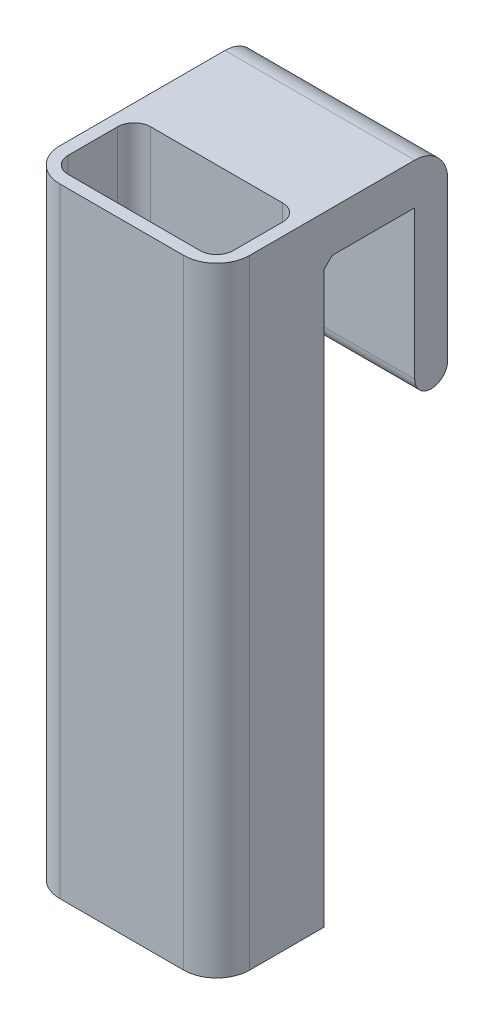
ISO-10303-21;
HEADER;
FILE_DESCRIPTION(('STEP AP214'),'2;1');
FILE_NAME('part.step','',(''),(''),'','','');
FILE_SCHEMA(('AUTOMOTIVE_DESIGN { 1 0 10303 214 1 1 1 1 }'));
ENDSEC;
DATA;
#1=APPLICATION_CONTEXT('core data for automotive mechanical design processes');
#2=APPLICATION_PROTOCOL_DEFINITION('international standard','automotive_design',2000,#1);
#3=PRODUCT_CONTEXT('',#1,'mechanical');
#4=PRODUCT('Part','Part','',(#3));
#5=PRODUCT_RELATED_PRODUCT_CATEGORY('part','',(#4));
#6=PRODUCT_DEFINITION_FORMATION('','',#4);
#7=PRODUCT_DEFINITION_CONTEXT('part definition',#1,'design');
#8=PRODUCT_DEFINITION('design','',#6,#7);
#9=PRODUCT_DEFINITION_SHAPE('','',#8);
#10=(LENGTH_UNIT() NAMED_UNIT(*) SI_UNIT(.MILLI.,.METRE.));
#11=(NAMED_UNIT(*) PLANE_ANGLE_UNIT() SI_UNIT($,.RADIAN.));
#12=(NAMED_UNIT(*) SI_UNIT($,.STERADIAN.) SOLID_ANGLE_UNIT());
#13=UNCERTAINTY_MEASURE_WITH_UNIT(LENGTH_MEASURE(1.E-05),#10,'distance_accuracy_value','');
#14=(GEOMETRIC_REPRESENTATION_CONTEXT(3) GLOBAL_UNCERTAINTY_ASSIGNED_CONTEXT((#13)) GLOBAL_UNIT_ASSIGNED_CONTEXT((#10,
#11,#12)) REPRESENTATION_CONTEXT('',''));
#15=CARTESIAN_POINT('',(0.,0.,0.));
#16=DIRECTION('',(0.,0.,1.));
#17=DIRECTION('',(1.,0.,0.));
#18=AXIS2_PLACEMENT_3D('',#15,#16,#17);
#19=CARTESIAN_POINT('',(23.,0.,0.));
#20=DIRECTION('',(0.,0.,-1.));
#21=DIRECTION('',(-1.,0.,0.));
#22=AXIS2_PLACEMENT_3D('',#19,#20,#21);
#23=PLANE('',#22);
#24=DIRECTION('',(-1.,0.,0.));
#25=VECTOR('',#24,1.);
#26=CARTESIAN_POINT('',(23.,75.,0.));
#27=LINE('',#26,#25);
#28=CARTESIAN_POINT('',(19.,75.,0.));
#29=VERTEX_POINT('',#28);
#30=CARTESIAN_POINT('',(4.,75.,0.));
#31=VERTEX_POINT('',#30);
#32=EDGE_CURVE('E241',#29,#31,#27,.T.);
#33=ORIENTED_EDGE('',*,*,#32,.T.);
#34=DIRECTION('',(0.,-1.,0.));
#35=VECTOR('',#34,1.);
#36=CARTESIAN_POINT('',(4.,0.,0.));
#37=LINE('',#36,#35);
#38=CARTESIAN_POINT('',(4.,0.,0.));
#39=VERTEX_POINT('',#38);
#40=EDGE_CURVE('E282',#31,#39,#37,.T.);
#41=ORIENTED_EDGE('',*,*,#40,.T.);
#42=DIRECTION('',(-1.,0.,0.));
#43=VECTOR('',#42,1.);
#44=CARTESIAN_POINT('',(23.,0.,0.));
#45=LINE('',#44,#43);
#46=CARTESIAN_POINT('',(19.,0.,0.));
#47=VERTEX_POINT('',#46);
#48=EDGE_CURVE('E218',#47,#39,#45,.T.);
#49=ORIENTED_EDGE('',*,*,#48,.F.);
#50=DIRECTION('',(0.,-1.,0.));
#51=VECTOR('',#50,1.);
#52=CARTESIAN_POINT('',(19.,0.,0.));
#53=LINE('',#52,#51);
#54=EDGE_CURVE('E279',#47,#29,#53,.F.);
#55=ORIENTED_EDGE('',*,*,#54,.T.);
#56=EDGE_LOOP('',(#33,#41,#49,#55));
#57=FACE_BOUND('',#56,.T.);
#58=ADVANCED_FACE('F51',(#57),#23,.F.);
#59=CARTESIAN_POINT('',(23.,0.,0.));
#60=DIRECTION('',(0.,1.,0.));
#61=DIRECTION('',(0.,0.,1.));
#62=AXIS2_PLACEMENT_3D('',#59,#60,#61);
#63=PLANE('',#62);
#64=ORIENTED_EDGE('',*,*,#48,.T.);
#65=CARTESIAN_POINT('',(4.,0.,-4.));
#66=DIRECTION('',(0.,1.,0.));
#67=DIRECTION('',(0.,0.,1.));
#68=AXIS2_PLACEMENT_3D('',#65,#66,#67);
#69=CIRCLE('',#68,4.);
#70=CARTESIAN_POINT('',(0.,0.,-4.));
#71=VERTEX_POINT('',#70);
#72=EDGE_CURVE('E289',#39,#71,#69,.F.);
#73=ORIENTED_EDGE('',*,*,#72,.T.);
#74=DIRECTION('',(0.,0.,-1.));
#75=VECTOR('',#74,1.);
#76=CARTESIAN_POINT('',(0.,0.,0.));
#77=LINE('',#76,#75);
#78=CARTESIAN_POINT('',(0.,0.,-13.));
#79=VERTEX_POINT('',#78);
#80=EDGE_CURVE('E213',#71,#79,#77,.T.);
#81=ORIENTED_EDGE('',*,*,#80,.T.);
#82=DIRECTION('',(-1.,0.,0.));
#83=VECTOR('',#82,1.);
#84=CARTESIAN_POINT('',(23.,0.,-13.));
#85=LINE('',#84,#83);
#86=CARTESIAN_POINT('',(23.,0.,-13.));
#87=VERTEX_POINT('',#86);
#88=EDGE_CURVE('E209',#87,#79,#85,.T.);
#89=ORIENTED_EDGE('',*,*,#88,.F.);
#90=DIRECTION('',(0.,0.,-1.));
#91=VECTOR('',#90,1.);
#92=CARTESIAN_POINT('',(23.,0.,0.));
#93=LINE('',#92,#91);
#94=CARTESIAN_POINT('',(23.,0.,-4.));
#95=VERTEX_POINT('',#94);
#96=EDGE_CURVE('E196',#95,#87,#93,.T.);
#97=ORIENTED_EDGE('',*,*,#96,.F.);
#98=CARTESIAN_POINT('',(19.,0.,-4.));
#99=DIRECTION('',(0.,1.,0.));
#100=DIRECTION('',(0.,0.,1.));
#101=AXIS2_PLACEMENT_3D('',#98,#99,#100);
#102=CIRCLE('',#101,4.);
#103=EDGE_CURVE('E286',#95,#47,#102,.F.);
#104=ORIENTED_EDGE('',*,*,#103,.T.);
#105=EDGE_LOOP('',(#64,#73,#81,#89,#97,#104));
#106=FACE_BOUND('',#105,.T.);
#107=ADVANCED_FACE('F211',(#106),#63,.F.);
#108=CARTESIAN_POINT('',(23.,0.,-13.));
#109=DIRECTION('',(0.,0.,1.));
#110=DIRECTION('',(1.,0.,0.));
#111=AXIS2_PLACEMENT_3D('',#108,#109,#110);
#112=PLANE('',#111);
#113=DIRECTION('',(0.,1.,0.));
#114=VECTOR('',#113,1.);
#115=CARTESIAN_POINT('',(0.,0.,-13.));
#116=LINE('',#115,#114);
#117=CARTESIAN_POINT('',(0.,69.,-13.));
#118=VERTEX_POINT('',#117);
#119=EDGE_CURVE('E244',#79,#118,#116,.T.);
#120=ORIENTED_EDGE('',*,*,#119,.T.);
#121=DIRECTION('',(1.,0.,0.));
#122=VECTOR('',#121,1.);
#123=CARTESIAN_POINT('',(23.,69.,-13.));
#124=LINE('',#123,#122);
#125=CARTESIAN_POINT('',(23.,69.,-13.));
#126=VERTEX_POINT('',#125);
#127=EDGE_CURVE('E223',#118,#126,#124,.T.);
#128=ORIENTED_EDGE('',*,*,#127,.T.);
#129=DIRECTION('',(0.,1.,0.));
#130=VECTOR('',#129,1.);
#131=CARTESIAN_POINT('',(23.,0.,-13.));
#132=LINE('',#131,#130);
#133=EDGE_CURVE('E200',#87,#126,#132,.T.);
#134=ORIENTED_EDGE('',*,*,#133,.F.);
#135=ORIENTED_EDGE('',*,*,#88,.T.);
#136=EDGE_LOOP('',(#120,#128,#134,#135));
#137=FACE_BOUND('',#136,.T.);
#138=ADVANCED_FACE('F221',(#137),#112,.F.);
#139=CARTESIAN_POINT('',(23.,70.,-24.));
#140=DIRECTION('',(0.,1.,0.));
#141=DIRECTION('',(0.,0.,1.));
#142=AXIS2_PLACEMENT_3D('',#139,#140,#141);
#143=PLANE('',#142);
#144=DIRECTION('',(0.,0.,-1.));
#145=VECTOR('',#144,1.);
#146=CARTESIAN_POINT('',(23.,70.,-24.));
#147=LINE('',#146,#145);
#148=CARTESIAN_POINT('',(23.,70.,-14.));
#149=VERTEX_POINT('',#148);
#150=CARTESIAN_POINT('',(23.,70.,-24.));
#151=VERTEX_POINT('',#150);
#152=EDGE_CURVE('E225',#149,#151,#147,.T.);
#153=ORIENTED_EDGE('',*,*,#152,.F.);
#154=DIRECTION('',(-1.,0.,0.));
#155=VECTOR('',#154,1.);
#156=CARTESIAN_POINT('',(0.,70.,-14.));
#157=LINE('',#156,#155);
#158=CARTESIAN_POINT('',(0.,70.,-14.));
#159=VERTEX_POINT('',#158);
#160=EDGE_CURVE('E267',#149,#159,#157,.T.);
#161=ORIENTED_EDGE('',*,*,#160,.T.);
#162=DIRECTION('',(0.,0.,-1.));
#163=VECTOR('',#162,1.);
#164=CARTESIAN_POINT('',(0.,70.,-24.));
#165=LINE('',#164,#163);
#166=CARTESIAN_POINT('',(0.,70.,-24.));
#167=VERTEX_POINT('',#166);
#168=EDGE_CURVE('E248',#159,#167,#165,.T.);
#169=ORIENTED_EDGE('',*,*,#168,.T.);
#170=DIRECTION('',(-1.,0.,0.));
#171=VECTOR('',#170,1.);
#172=CARTESIAN_POINT('',(23.,70.,-24.));
#173=LINE('',#172,#171);
#174=EDGE_CURVE('E219',#151,#167,#173,.T.);
#175=ORIENTED_EDGE('',*,*,#174,.F.);
#176=EDGE_LOOP('',(#153,#161,#169,#175));
#177=FACE_BOUND('',#176,.T.);
#178=ADVANCED_FACE('F516',(#177),#143,.F.);
#179=CARTESIAN_POINT('',(23.,50.,-24.));
#180=DIRECTION('',(0.,0.,-1.));
#181=DIRECTION('',(0.,1.,0.));
#182=AXIS2_PLACEMENT_3D('',#179,#180,#181);
#183=PLANE('',#182);
#184=DIRECTION('',(0.,-1.,0.));
#185=VECTOR('',#184,1.);
#186=CARTESIAN_POINT('',(0.,50.,-24.));
#187=LINE('',#186,#185);
#188=CARTESIAN_POINT('',(0.,52.,-24.));
#189=VERTEX_POINT('',#188);
#190=EDGE_CURVE('E251',#167,#189,#187,.T.);
#191=ORIENTED_EDGE('',*,*,#190,.T.);
#192=DIRECTION('',(-1.,0.,0.));
#193=VECTOR('',#192,1.);
#194=CARTESIAN_POINT('',(23.,52.,-24.));
#195=LINE('',#194,#193);
#196=CARTESIAN_POINT('',(23.,52.,-24.));
#197=VERTEX_POINT('',#196);
#198=EDGE_CURVE('E12',#189,#197,#195,.F.);
#199=ORIENTED_EDGE('',*,*,#198,.T.);
#200=DIRECTION('',(0.,-1.,0.));
#201=VECTOR('',#200,1.);
#202=CARTESIAN_POINT('',(23.,50.,-24.));
#203=LINE('',#202,#201);
#204=EDGE_CURVE('E229',#151,#197,#203,.T.);
#205=ORIENTED_EDGE('',*,*,#204,.F.);
#206=ORIENTED_EDGE('',*,*,#174,.T.);
#207=EDGE_LOOP('',(#191,#199,#205,#206));
#208=FACE_BOUND('',#207,.T.);
#209=ADVANCED_FACE('F517',(#208),#183,.F.);
#210=CARTESIAN_POINT('',(23.,75.,-28.));
#211=DIRECTION('',(0.,0.,1.));
#212=DIRECTION('',(0.,-1.,0.));
#213=AXIS2_PLACEMENT_3D('',#210,#211,#212);
#214=PLANE('',#213);
#215=DIRECTION('',(0.,1.,0.));
#216=VECTOR('',#215,1.);
#217=CARTESIAN_POINT('',(23.,75.,-28.));
#218=LINE('',#217,#216);
#219=CARTESIAN_POINT('',(23.,52.,-28.));
#220=VERTEX_POINT('',#219);
#221=CARTESIAN_POINT('',(23.,71.,-28.));
#222=VERTEX_POINT('',#221);
#223=EDGE_CURVE('E235',#220,#222,#218,.T.);
#224=ORIENTED_EDGE('',*,*,#223,.F.);
#225=DIRECTION('',(-1.,0.,0.));
#226=VECTOR('',#225,1.);
#227=CARTESIAN_POINT('',(23.,52.,-28.));
#228=LINE('',#227,#226);
#229=CARTESIAN_POINT('',(0.,52.,-28.));
#230=VERTEX_POINT('',#229);
#231=EDGE_CURVE('E372',#220,#230,#228,.T.);
#232=ORIENTED_EDGE('',*,*,#231,.T.);
#233=DIRECTION('',(0.,1.,0.));
#234=VECTOR('',#233,1.);
#235=CARTESIAN_POINT('',(0.,75.,-28.));
#236=LINE('',#235,#234);
#237=CARTESIAN_POINT('',(0.,71.,-28.));
#238=VERTEX_POINT('',#237);
#239=EDGE_CURVE('E254',#230,#238,#236,.T.);
#240=ORIENTED_EDGE('',*,*,#239,.T.);
#241=DIRECTION('',(-1.,0.,0.));
#242=VECTOR('',#241,1.);
#243=CARTESIAN_POINT('',(23.,71.,-28.));
#244=LINE('',#243,#242);
#245=EDGE_CURVE('E365',#238,#222,#244,.F.);
#246=ORIENTED_EDGE('',*,*,#245,.T.);
#247=EDGE_LOOP('',(#224,#232,#240,#246));
#248=FACE_BOUND('',#247,.T.);
#249=ADVANCED_FACE('F391',(#248),#214,.F.);
#250=CARTESIAN_POINT('',(23.,75.,0.));
#251=DIRECTION('',(0.,-1.,0.));
#252=DIRECTION('',(0.,0.,-1.));
#253=AXIS2_PLACEMENT_3D('',#250,#251,#252);
#254=PLANE('',#253);
#255=DIRECTION('',(0.,0.,1.));
#256=VECTOR('',#255,1.);
#257=CARTESIAN_POINT('',(1.5,75.,-11.5));
#258=LINE('',#257,#256);
#259=CARTESIAN_POINT('',(1.5,75.,-9.5));
#260=VERTEX_POINT('',#259);
#261=CARTESIAN_POINT('',(1.5,75.,-3.5));
#262=VERTEX_POINT('',#261);
#263=EDGE_CURVE('E405',#260,#262,#258,.T.);
#264=ORIENTED_EDGE('',*,*,#263,.F.);
#265=CARTESIAN_POINT('',(3.5,75.,-9.5));
#266=DIRECTION('',(0.,-1.,0.));
#267=DIRECTION('',(0.,0.,-1.));
#268=AXIS2_PLACEMENT_3D('',#265,#266,#267);
#269=CIRCLE('',#268,2.);
#270=CARTESIAN_POINT('',(3.5,75.,-11.5));
#271=VERTEX_POINT('',#270);
#272=EDGE_CURVE('E354',#260,#271,#269,.T.);
#273=ORIENTED_EDGE('',*,*,#272,.T.);
#274=DIRECTION('',(-1.,0.,0.));
#275=VECTOR('',#274,1.);
#276=CARTESIAN_POINT('',(21.5,75.,-11.5));
#277=LINE('',#276,#275);
#278=CARTESIAN_POINT('',(19.5,75.,-11.5));
#279=VERTEX_POINT('',#278);
#280=EDGE_CURVE('E402',#279,#271,#277,.T.);
#281=ORIENTED_EDGE('',*,*,#280,.F.);
#282=CARTESIAN_POINT('',(19.5,75.,-9.5));
#283=DIRECTION('',(0.,-1.,0.));
#284=DIRECTION('',(0.,0.,-1.));
#285=AXIS2_PLACEMENT_3D('',#282,#283,#284);
#286=CIRCLE('',#285,2.);
#287=CARTESIAN_POINT('',(21.5,75.,-9.5));
#288=VERTEX_POINT('',#287);
#289=EDGE_CURVE('E348',#279,#288,#286,.T.);
#290=ORIENTED_EDGE('',*,*,#289,.T.);
#291=DIRECTION('',(0.,0.,-1.));
#292=VECTOR('',#291,1.);
#293=CARTESIAN_POINT('',(21.5,75.,-1.5));
#294=LINE('',#293,#292);
#295=CARTESIAN_POINT('',(21.5,75.,-3.5));
#296=VERTEX_POINT('',#295);
#297=EDGE_CURVE('E420',#296,#288,#294,.T.);
#298=ORIENTED_EDGE('',*,*,#297,.F.);
#299=CARTESIAN_POINT('',(19.5,75.,-3.5));
#300=DIRECTION('',(0.,-1.,0.));
#301=DIRECTION('',(0.,0.,-1.));
#302=AXIS2_PLACEMENT_3D('',#299,#300,#301);
#303=CIRCLE('',#302,2.);
#304=CARTESIAN_POINT('',(19.5,75.,-1.5));
#305=VERTEX_POINT('',#304);
#306=EDGE_CURVE('E345',#296,#305,#303,.T.);
#307=ORIENTED_EDGE('',*,*,#306,.T.);
#308=DIRECTION('',(1.,0.,0.));
#309=VECTOR('',#308,1.);
#310=CARTESIAN_POINT('',(1.5,75.,-1.5));
#311=LINE('',#310,#309);
#312=CARTESIAN_POINT('',(3.5,75.,-1.5));
#313=VERTEX_POINT('',#312);
#314=EDGE_CURVE('E411',#313,#305,#311,.T.);
#315=ORIENTED_EDGE('',*,*,#314,.F.);
#316=CARTESIAN_POINT('',(3.5,75.,-3.5));
#317=DIRECTION('',(0.,-1.,0.));
#318=DIRECTION('',(0.,0.,-1.));
#319=AXIS2_PLACEMENT_3D('',#316,#317,#318);
#320=CIRCLE('',#319,2.);
#321=EDGE_CURVE('E351',#313,#262,#320,.T.);
#322=ORIENTED_EDGE('',*,*,#321,.T.);
#323=EDGE_LOOP('',(#264,#273,#281,#290,#298,#307,#315,#322));
#324=FACE_BOUND('',#323,.T.);
#325=DIRECTION('',(0.,0.,1.));
#326=VECTOR('',#325,1.);
#327=CARTESIAN_POINT('',(23.,75.,0.));
#328=LINE('',#327,#326);
#329=CARTESIAN_POINT('',(23.,75.,-24.));
#330=VERTEX_POINT('',#329);
#331=CARTESIAN_POINT('',(23.,75.,-4.));
#332=VERTEX_POINT('',#331);
#333=EDGE_CURVE('E238',#330,#332,#328,.T.);
#334=ORIENTED_EDGE('',*,*,#333,.F.);
#335=DIRECTION('',(-1.,0.,0.));
#336=VECTOR('',#335,1.);
#337=CARTESIAN_POINT('',(23.,75.,-24.));
#338=LINE('',#337,#336);
#339=CARTESIAN_POINT('',(0.,75.,-24.));
#340=VERTEX_POINT('',#339);
#341=EDGE_CURVE('E357',#330,#340,#338,.T.);
#342=ORIENTED_EDGE('',*,*,#341,.T.);
#343=DIRECTION('',(0.,0.,1.));
#344=VECTOR('',#343,1.);
#345=CARTESIAN_POINT('',(0.,75.,0.));
#346=LINE('',#345,#344);
#347=CARTESIAN_POINT('',(0.,75.,-4.));
#348=VERTEX_POINT('',#347);
#349=EDGE_CURVE('E206',#340,#348,#346,.T.);
#350=ORIENTED_EDGE('',*,*,#349,.T.);
#351=CARTESIAN_POINT('',(4.,75.,-4.));
#352=DIRECTION('',(0.,-1.,0.));
#353=DIRECTION('',(0.,0.,-1.));
#354=AXIS2_PLACEMENT_3D('',#351,#352,#353);
#355=CIRCLE('',#354,4.);
#356=EDGE_CURVE('E300',#348,#31,#355,.F.);
#357=ORIENTED_EDGE('',*,*,#356,.T.);
#358=ORIENTED_EDGE('',*,*,#32,.F.);
#359=CARTESIAN_POINT('',(19.,75.,-4.));
#360=DIRECTION('',(0.,-1.,0.));
#361=DIRECTION('',(0.,0.,-1.));
#362=AXIS2_PLACEMENT_3D('',#359,#360,#361);
#363=CIRCLE('',#362,4.);
#364=EDGE_CURVE('E296',#29,#332,#363,.F.);
#365=ORIENTED_EDGE('',*,*,#364,.T.);
#366=EDGE_LOOP('',(#334,#342,#350,#357,#358,#365));
#367=FACE_BOUND('',#366,.T.);
#368=ADVANCED_FACE('F456',(#324,#367),#254,.F.);
#369=CARTESIAN_POINT('',(23.,0.,0.));
#370=DIRECTION('',(-1.,0.,0.));
#371=DIRECTION('',(0.,0.,1.));
#372=AXIS2_PLACEMENT_3D('',#369,#370,#371);
#373=PLANE('',#372);
#374=CARTESIAN_POINT('',(23.,52.,-26.));
#375=DIRECTION('',(-1.,0.,0.));
#376=DIRECTION('',(0.,0.,1.));
#377=AXIS2_PLACEMENT_3D('',#374,#375,#376);
#378=CIRCLE('',#377,2.);
#379=CARTESIAN_POINT('',(23.,50.,-26.));
#380=VERTEX_POINT('',#379);
#381=EDGE_CURVE('E68',#197,#380,#378,.F.);
#382=ORIENTED_EDGE('',*,*,#381,.T.);
#383=CARTESIAN_POINT('',(23.,52.,-26.));
#384=DIRECTION('',(-1.,0.,0.));
#385=DIRECTION('',(0.,0.,1.));
#386=AXIS2_PLACEMENT_3D('',#383,#384,#385);
#387=CIRCLE('',#386,2.);
#388=EDGE_CURVE('E61',#380,#220,#387,.F.);
#389=ORIENTED_EDGE('',*,*,#388,.T.);
#390=ORIENTED_EDGE('',*,*,#223,.T.);
#391=CARTESIAN_POINT('',(23.,71.,-24.));
#392=DIRECTION('',(-1.,0.,0.));
#393=DIRECTION('',(0.,0.,1.));
#394=AXIS2_PLACEMENT_3D('',#391,#392,#393);
#395=CIRCLE('',#394,4.);
#396=EDGE_CURVE('E369',#222,#330,#395,.F.);
#397=ORIENTED_EDGE('',*,*,#396,.T.);
#398=ORIENTED_EDGE('',*,*,#333,.T.);
#399=DIRECTION('',(0.,-1.,0.));
#400=VECTOR('',#399,1.);
#401=CARTESIAN_POINT('',(23.,0.,-4.));
#402=LINE('',#401,#400);
#403=EDGE_CURVE('E203',#332,#95,#402,.T.);
#404=ORIENTED_EDGE('',*,*,#403,.T.);
#405=ORIENTED_EDGE('',*,*,#96,.T.);
#406=ORIENTED_EDGE('',*,*,#133,.T.);
#407=DIRECTION('',(0.,-0.707106781186543,0.707106781186552));
#408=VECTOR('',#407,1.);
#409=CARTESIAN_POINT('',(23.,28.0000000000005,28.0000000000001));
#410=LINE('',#409,#408);
#411=EDGE_CURVE('E276',#126,#149,#410,.F.);
#412=ORIENTED_EDGE('',*,*,#411,.T.);
#413=ORIENTED_EDGE('',*,*,#152,.T.);
#414=ORIENTED_EDGE('',*,*,#204,.T.);
#415=EDGE_LOOP('',(#382,#389,#390,#397,#398,#404,#405,#406,#412,#413,#414));
#416=FACE_BOUND('',#415,.T.);
#417=ADVANCED_FACE('F198',(#416),#373,.F.);
#418=CARTESIAN_POINT('',(0.,0.,0.));
#419=DIRECTION('',(-1.,0.,0.));
#420=DIRECTION('',(0.,0.,1.));
#421=AXIS2_PLACEMENT_3D('',#418,#419,#420);
#422=PLANE('',#421);
#423=ORIENTED_EDGE('',*,*,#239,.F.);
#424=CARTESIAN_POINT('',(0.,52.,-26.));
#425=DIRECTION('',(-1.,0.,0.));
#426=DIRECTION('',(0.,0.,1.));
#427=AXIS2_PLACEMENT_3D('',#424,#425,#426);
#428=CIRCLE('',#427,2.);
#429=CARTESIAN_POINT('',(0.,50.,-26.));
#430=VERTEX_POINT('',#429);
#431=EDGE_CURVE('E379',#230,#430,#428,.T.);
#432=ORIENTED_EDGE('',*,*,#431,.T.);
#433=CARTESIAN_POINT('',(0.,52.,-26.));
#434=DIRECTION('',(-1.,0.,0.));
#435=DIRECTION('',(0.,0.,1.));
#436=AXIS2_PLACEMENT_3D('',#433,#434,#435);
#437=CIRCLE('',#436,2.);
#438=EDGE_CURVE('E376',#430,#189,#437,.T.);
#439=ORIENTED_EDGE('',*,*,#438,.T.);
#440=ORIENTED_EDGE('',*,*,#190,.F.);
#441=ORIENTED_EDGE('',*,*,#168,.F.);
#442=DIRECTION('',(0.,0.707106781186543,-0.707106781186552));
#443=VECTOR('',#442,1.);
#444=CARTESIAN_POINT('',(0.,70.,-14.));
#445=LINE('',#444,#443);
#446=EDGE_CURVE('E273',#159,#118,#445,.F.);
#447=ORIENTED_EDGE('',*,*,#446,.T.);
#448=ORIENTED_EDGE('',*,*,#119,.F.);
#449=ORIENTED_EDGE('',*,*,#80,.F.);
#450=DIRECTION('',(0.,-1.,0.));
#451=VECTOR('',#450,1.);
#452=CARTESIAN_POINT('',(0.,75.,-4.));
#453=LINE('',#452,#451);
#454=EDGE_CURVE('E292',#71,#348,#453,.F.);
#455=ORIENTED_EDGE('',*,*,#454,.T.);
#456=ORIENTED_EDGE('',*,*,#349,.F.);
#457=CARTESIAN_POINT('',(0.,71.,-24.));
#458=DIRECTION('',(-1.,0.,0.));
#459=DIRECTION('',(0.,0.,1.));
#460=AXIS2_PLACEMENT_3D('',#457,#458,#459);
#461=CIRCLE('',#460,4.);
#462=EDGE_CURVE('E361',#340,#238,#461,.T.);
#463=ORIENTED_EDGE('',*,*,#462,.T.);
#464=EDGE_LOOP('',(#423,#432,#439,#440,#441,#447,#448,#449,#455,#456,#463));
#465=FACE_BOUND('',#464,.T.);
#466=ADVANCED_FACE('F398',(#465),#422,.T.);
#467=CARTESIAN_POINT('',(21.5,-22.3606797749979,-11.5));
#468=DIRECTION('',(0.,0.,-1.));
#469=DIRECTION('',(-1.,0.,0.));
#470=AXIS2_PLACEMENT_3D('',#467,#468,#469);
#471=PLANE('',#470);
#472=DIRECTION('',(1.,0.,0.));
#473=VECTOR('',#472,1.);
#474=CARTESIAN_POINT('',(21.5,2.,-11.5));
#475=LINE('',#474,#473);
#476=CARTESIAN_POINT('',(3.5,2.,-11.5));
#477=VERTEX_POINT('',#476);
#478=CARTESIAN_POINT('',(19.5,2.,-11.5));
#479=VERTEX_POINT('',#478);
#480=EDGE_CURVE('E414',#477,#479,#475,.T.);
#481=ORIENTED_EDGE('',*,*,#480,.T.);
#482=DIRECTION('',(0.,1.,0.));
#483=VECTOR('',#482,1.);
#484=CARTESIAN_POINT('',(19.5,75.,-11.5));
#485=LINE('',#484,#483);
#486=EDGE_CURVE('E334',#479,#279,#485,.T.);
#487=ORIENTED_EDGE('',*,*,#486,.T.);
#488=ORIENTED_EDGE('',*,*,#280,.T.);
#489=DIRECTION('',(0.,1.,0.));
#490=VECTOR('',#489,1.);
#491=CARTESIAN_POINT('',(3.5,2.,-11.5));
#492=LINE('',#491,#490);
#493=EDGE_CURVE('E331',#271,#477,#492,.F.);
#494=ORIENTED_EDGE('',*,*,#493,.T.);
#495=EDGE_LOOP('',(#481,#487,#488,#494));
#496=FACE_BOUND('',#495,.T.);
#497=ADVANCED_FACE('F569',(#496),#471,.F.);
#498=CARTESIAN_POINT('',(21.5,-22.3606797749979,-1.5));
#499=DIRECTION('',(1.,0.,0.));
#500=DIRECTION('',(0.,0.,-1.));
#501=AXIS2_PLACEMENT_3D('',#498,#499,#500);
#502=PLANE('',#501);
#503=DIRECTION('',(0.,0.,1.));
#504=VECTOR('',#503,1.);
#505=CARTESIAN_POINT('',(21.5,2.,-1.5));
#506=LINE('',#505,#504);
#507=CARTESIAN_POINT('',(21.5,2.,-9.5));
#508=VERTEX_POINT('',#507);
#509=CARTESIAN_POINT('',(21.5,2.,-3.5));
#510=VERTEX_POINT('',#509);
#511=EDGE_CURVE('E431',#508,#510,#506,.T.);
#512=ORIENTED_EDGE('',*,*,#511,.T.);
#513=DIRECTION('',(0.,1.,0.));
#514=VECTOR('',#513,1.);
#515=CARTESIAN_POINT('',(21.5,75.,-3.5));
#516=LINE('',#515,#514);
#517=EDGE_CURVE('E308',#510,#296,#516,.T.);
#518=ORIENTED_EDGE('',*,*,#517,.T.);
#519=ORIENTED_EDGE('',*,*,#297,.T.);
#520=DIRECTION('',(0.,1.,0.));
#521=VECTOR('',#520,1.);
#522=CARTESIAN_POINT('',(21.5,2.,-9.5));
#523=LINE('',#522,#521);
#524=EDGE_CURVE('E305',#288,#508,#523,.F.);
#525=ORIENTED_EDGE('',*,*,#524,.T.);
#526=EDGE_LOOP('',(#512,#518,#519,#525));
#527=FACE_BOUND('',#526,.T.);
#528=ADVANCED_FACE('F465',(#527),#502,.F.);
#529=CARTESIAN_POINT('',(1.5,-22.3606797749979,-1.5));
#530=DIRECTION('',(0.,0.,1.));
#531=DIRECTION('',(1.,0.,0.));
#532=AXIS2_PLACEMENT_3D('',#529,#530,#531);
#533=PLANE('',#532);
#534=ORIENTED_EDGE('',*,*,#314,.T.);
#535=DIRECTION('',(0.,1.,0.));
#536=VECTOR('',#535,1.);
#537=CARTESIAN_POINT('',(19.5,2.,-1.5));
#538=LINE('',#537,#536);
#539=CARTESIAN_POINT('',(19.5,2.,-1.5));
#540=VERTEX_POINT('',#539);
#541=EDGE_CURVE('E316',#305,#540,#538,.F.);
#542=ORIENTED_EDGE('',*,*,#541,.T.);
#543=DIRECTION('',(-1.,0.,0.));
#544=VECTOR('',#543,1.);
#545=CARTESIAN_POINT('',(1.5,2.,-1.5));
#546=LINE('',#545,#544);
#547=CARTESIAN_POINT('',(3.5,2.,-1.5));
#548=VERTEX_POINT('',#547);
#549=EDGE_CURVE('E423',#540,#548,#546,.T.);
#550=ORIENTED_EDGE('',*,*,#549,.T.);
#551=DIRECTION('',(0.,1.,0.));
#552=VECTOR('',#551,1.);
#553=CARTESIAN_POINT('',(3.5,75.,-1.5));
#554=LINE('',#553,#552);
#555=EDGE_CURVE('E312',#548,#313,#554,.T.);
#556=ORIENTED_EDGE('',*,*,#555,.T.);
#557=EDGE_LOOP('',(#534,#542,#550,#556));
#558=FACE_BOUND('',#557,.T.);
#559=ADVANCED_FACE('F445',(#558),#533,.F.);
#560=CARTESIAN_POINT('',(1.5,-22.3606797749979,-11.5));
#561=DIRECTION('',(-1.,0.,0.));
#562=DIRECTION('',(0.,0.,1.));
#563=AXIS2_PLACEMENT_3D('',#560,#561,#562);
#564=PLANE('',#563);
#565=ORIENTED_EDGE('',*,*,#263,.T.);
#566=DIRECTION('',(0.,1.,0.));
#567=VECTOR('',#566,1.);
#568=CARTESIAN_POINT('',(1.5,2.,-3.5));
#569=LINE('',#568,#567);
#570=CARTESIAN_POINT('',(1.5,2.,-3.5));
#571=VERTEX_POINT('',#570);
#572=EDGE_CURVE('E342',#262,#571,#569,.F.);
#573=ORIENTED_EDGE('',*,*,#572,.T.);
#574=DIRECTION('',(0.,0.,-1.));
#575=VECTOR('',#574,1.);
#576=CARTESIAN_POINT('',(1.5,2.,-11.5));
#577=LINE('',#576,#575);
#578=CARTESIAN_POINT('',(1.5,2.,-9.5));
#579=VERTEX_POINT('',#578);
#580=EDGE_CURVE('E245',#571,#579,#577,.T.);
#581=ORIENTED_EDGE('',*,*,#580,.T.);
#582=DIRECTION('',(0.,1.,0.));
#583=VECTOR('',#582,1.);
#584=CARTESIAN_POINT('',(1.5,75.,-9.5));
#585=LINE('',#584,#583);
#586=EDGE_CURVE('E338',#579,#260,#585,.T.);
#587=ORIENTED_EDGE('',*,*,#586,.T.);
#588=EDGE_LOOP('',(#565,#573,#581,#587));
#589=FACE_BOUND('',#588,.T.);
#590=ADVANCED_FACE('F458',(#589),#564,.F.);
#591=CARTESIAN_POINT('',(23.,2.,0.));
#592=DIRECTION('',(0.,1.,0.));
#593=DIRECTION('',(0.,0.,1.));
#594=AXIS2_PLACEMENT_3D('',#591,#592,#593);
#595=PLANE('',#594);
#596=ORIENTED_EDGE('',*,*,#549,.F.);
#597=CARTESIAN_POINT('',(19.5,2.,-3.5));
#598=DIRECTION('',(0.,1.,0.));
#599=DIRECTION('',(0.,0.,1.));
#600=AXIS2_PLACEMENT_3D('',#597,#598,#599);
#601=CIRCLE('',#600,2.);
#602=EDGE_CURVE('E328',#540,#510,#601,.T.);
#603=ORIENTED_EDGE('',*,*,#602,.T.);
#604=ORIENTED_EDGE('',*,*,#511,.F.);
#605=CARTESIAN_POINT('',(19.5,2.,-9.5));
#606=DIRECTION('',(0.,1.,0.));
#607=DIRECTION('',(0.,0.,1.));
#608=AXIS2_PLACEMENT_3D('',#605,#606,#607);
#609=CIRCLE('',#608,2.);
#610=EDGE_CURVE('E325',#508,#479,#609,.T.);
#611=ORIENTED_EDGE('',*,*,#610,.T.);
#612=ORIENTED_EDGE('',*,*,#480,.F.);
#613=CARTESIAN_POINT('',(3.5,2.,-9.5));
#614=DIRECTION('',(0.,1.,0.));
#615=DIRECTION('',(0.,0.,1.));
#616=AXIS2_PLACEMENT_3D('',#613,#614,#615);
#617=CIRCLE('',#616,2.);
#618=EDGE_CURVE('E319',#477,#579,#617,.T.);
#619=ORIENTED_EDGE('',*,*,#618,.T.);
#620=ORIENTED_EDGE('',*,*,#580,.F.);
#621=CARTESIAN_POINT('',(3.5,2.,-3.5));
#622=DIRECTION('',(0.,1.,0.));
#623=DIRECTION('',(0.,0.,1.));
#624=AXIS2_PLACEMENT_3D('',#621,#622,#623);
#625=CIRCLE('',#624,2.);
#626=EDGE_CURVE('E322',#571,#548,#625,.T.);
#627=ORIENTED_EDGE('',*,*,#626,.T.);
#628=EDGE_LOOP('',(#596,#603,#604,#611,#612,#619,#620,#627));
#629=FACE_BOUND('',#628,.T.);
#630=ADVANCED_FACE('F468',(#629),#595,.T.);
#631=CARTESIAN_POINT('',(23.,70.,-14.));
#632=DIRECTION('',(0.,-0.707106781186552,-0.707106781186542));
#633=DIRECTION('',(1.,0.,0.));
#634=AXIS2_PLACEMENT_3D('',#631,#632,#633);
#635=PLANE('',#634);
#636=ORIENTED_EDGE('',*,*,#411,.F.);
#637=ORIENTED_EDGE('',*,*,#127,.F.);
#638=ORIENTED_EDGE('',*,*,#446,.F.);
#639=ORIENTED_EDGE('',*,*,#160,.F.);
#640=EDGE_LOOP('',(#636,#637,#638,#639));
#641=FACE_BOUND('',#640,.T.);
#642=ADVANCED_FACE('F490',(#641),#635,.T.);
#643=CARTESIAN_POINT('',(4.,0.,-4.));
#644=DIRECTION('',(0.,1.,0.));
#645=DIRECTION('',(0.,0.,1.));
#646=AXIS2_PLACEMENT_3D('',#643,#644,#645);
#647=CYLINDRICAL_SURFACE('',#646,4.);
#648=ORIENTED_EDGE('',*,*,#356,.F.);
#649=ORIENTED_EDGE('',*,*,#454,.F.);
#650=ORIENTED_EDGE('',*,*,#72,.F.);
#651=ORIENTED_EDGE('',*,*,#40,.F.);
#652=EDGE_LOOP('',(#648,#649,#650,#651));
#653=FACE_BOUND('',#652,.T.);
#654=ADVANCED_FACE('F478',(#653),#647,.T.);
#655=CARTESIAN_POINT('',(19.,0.,-4.));
#656=DIRECTION('',(0.,-1.,0.));
#657=DIRECTION('',(0.,0.,-1.));
#658=AXIS2_PLACEMENT_3D('',#655,#656,#657);
#659=CYLINDRICAL_SURFACE('',#658,4.);
#660=ORIENTED_EDGE('',*,*,#364,.F.);
#661=ORIENTED_EDGE('',*,*,#54,.F.);
#662=ORIENTED_EDGE('',*,*,#103,.F.);
#663=ORIENTED_EDGE('',*,*,#403,.F.);
#664=EDGE_LOOP('',(#660,#661,#662,#663));
#665=FACE_BOUND('',#664,.T.);
#666=ADVANCED_FACE('F472',(#665),#659,.T.);
#667=CARTESIAN_POINT('',(19.5,-22.3606797749979,-3.5));
#668=DIRECTION('',(0.,-1.,0.));
#669=DIRECTION('',(0.,0.,-1.));
#670=AXIS2_PLACEMENT_3D('',#667,#668,#669);
#671=CYLINDRICAL_SURFACE('',#670,2.);
#672=ORIENTED_EDGE('',*,*,#602,.F.);
#673=ORIENTED_EDGE('',*,*,#541,.F.);
#674=ORIENTED_EDGE('',*,*,#306,.F.);
#675=ORIENTED_EDGE('',*,*,#517,.F.);
#676=EDGE_LOOP('',(#672,#673,#674,#675));
#677=FACE_BOUND('',#676,.T.);
#678=ADVANCED_FACE('F470',(#677),#671,.F.);
#679=CARTESIAN_POINT('',(19.5,-22.3606797749979,-9.5));
#680=DIRECTION('',(0.,-1.,0.));
#681=DIRECTION('',(0.,0.,-1.));
#682=AXIS2_PLACEMENT_3D('',#679,#680,#681);
#683=CYLINDRICAL_SURFACE('',#682,2.);
#684=ORIENTED_EDGE('',*,*,#610,.F.);
#685=ORIENTED_EDGE('',*,*,#524,.F.);
#686=ORIENTED_EDGE('',*,*,#289,.F.);
#687=ORIENTED_EDGE('',*,*,#486,.F.);
#688=EDGE_LOOP('',(#684,#685,#686,#687));
#689=FACE_BOUND('',#688,.T.);
#690=ADVANCED_FACE('F467',(#689),#683,.F.);
#691=CARTESIAN_POINT('',(3.5,-22.3606797749979,-3.5));
#692=DIRECTION('',(0.,-1.,0.));
#693=DIRECTION('',(0.,0.,-1.));
#694=AXIS2_PLACEMENT_3D('',#691,#692,#693);
#695=CYLINDRICAL_SURFACE('',#694,2.);
#696=ORIENTED_EDGE('',*,*,#626,.F.);
#697=ORIENTED_EDGE('',*,*,#572,.F.);
#698=ORIENTED_EDGE('',*,*,#321,.F.);
#699=ORIENTED_EDGE('',*,*,#555,.F.);
#700=EDGE_LOOP('',(#696,#697,#698,#699));
#701=FACE_BOUND('',#700,.T.);
#702=ADVANCED_FACE('F452',(#701),#695,.F.);
#703=CARTESIAN_POINT('',(3.5,-22.3606797749979,-9.5));
#704=DIRECTION('',(0.,-1.,0.));
#705=DIRECTION('',(0.,0.,-1.));
#706=AXIS2_PLACEMENT_3D('',#703,#704,#705);
#707=CYLINDRICAL_SURFACE('',#706,2.);
#708=ORIENTED_EDGE('',*,*,#618,.F.);
#709=ORIENTED_EDGE('',*,*,#493,.F.);
#710=ORIENTED_EDGE('',*,*,#272,.F.);
#711=ORIENTED_EDGE('',*,*,#586,.F.);
#712=EDGE_LOOP('',(#708,#709,#710,#711));
#713=FACE_BOUND('',#712,.T.);
#714=ADVANCED_FACE('F461',(#713),#707,.F.);
#715=CARTESIAN_POINT('',(23.,71.,-24.));
#716=DIRECTION('',(-1.,0.,0.));
#717=DIRECTION('',(0.,0.,1.));
#718=AXIS2_PLACEMENT_3D('',#715,#716,#717);
#719=CYLINDRICAL_SURFACE('',#718,4.);
#720=ORIENTED_EDGE('',*,*,#396,.F.);
#721=ORIENTED_EDGE('',*,*,#245,.F.);
#722=ORIENTED_EDGE('',*,*,#462,.F.);
#723=ORIENTED_EDGE('',*,*,#341,.F.);
#724=EDGE_LOOP('',(#720,#721,#722,#723));
#725=FACE_BOUND('',#724,.T.);
#726=ADVANCED_FACE('F510',(#725),#719,.T.);
#727=CARTESIAN_POINT('',(23.,52.,-26.));
#728=DIRECTION('',(-1.,0.,0.));
#729=DIRECTION('',(0.,0.,1.));
#730=AXIS2_PLACEMENT_3D('',#727,#728,#729);
#731=CYLINDRICAL_SURFACE('',#730,2.);
#732=DIRECTION('',(-1.,0.,0.));
#733=VECTOR('',#732,1.);
#734=CARTESIAN_POINT('',(23.,50.,-26.));
#735=LINE('',#734,#733);
#736=EDGE_CURVE('E55',#380,#430,#735,.T.);
#737=ORIENTED_EDGE('',*,*,#736,.F.);
#738=ORIENTED_EDGE('',*,*,#381,.F.);
#739=ORIENTED_EDGE('',*,*,#198,.F.);
#740=ORIENTED_EDGE('',*,*,#438,.F.);
#741=EDGE_LOOP('',(#737,#738,#739,#740));
#742=FACE_BOUND('',#741,.T.);
#743=ADVANCED_FACE('F53',(#742),#731,.T.);
#744=CARTESIAN_POINT('',(23.,52.,-26.));
#745=DIRECTION('',(-1.,0.,0.));
#746=DIRECTION('',(0.,0.,1.));
#747=AXIS2_PLACEMENT_3D('',#744,#745,#746);
#748=CYLINDRICAL_SURFACE('',#747,2.);
#749=ORIENTED_EDGE('',*,*,#388,.F.);
#750=ORIENTED_EDGE('',*,*,#736,.T.);
#751=ORIENTED_EDGE('',*,*,#431,.F.);
#752=ORIENTED_EDGE('',*,*,#231,.F.);
#753=EDGE_LOOP('',(#749,#750,#751,#752));
#754=FACE_BOUND('',#753,.T.);
#755=ADVANCED_FACE('F395',(#754),#748,.T.);
#756=CLOSED_SHELL('',(#58,#107,#138,#178,#209,#249,#368,#417,#466,#497,#528,#559,#590,#630,#642,
#654,#666,#678,#690,#702,#714,#726,#743,#755));
#757=MANIFOLD_SOLID_BREP('B2',#756);
#758=ADVANCED_BREP_SHAPE_REPRESENTATION('',(#18,#757),#14);
#759=SHAPE_DEFINITION_REPRESENTATION(#9,#758);
ENDSEC;
END-ISO-10303-21;
